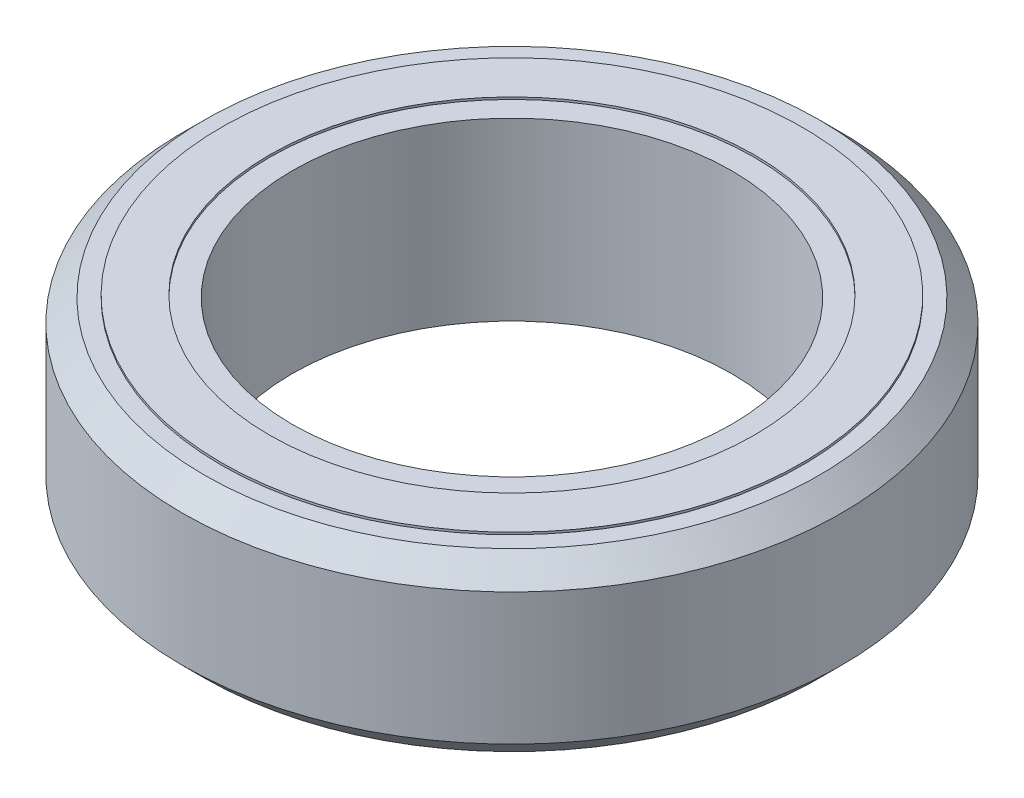
ISO-10303-21;
HEADER;
FILE_DESCRIPTION(('STEP AP214'),'2;1');
FILE_NAME('part.step','',(''),(''),'','','');
FILE_SCHEMA(('AUTOMOTIVE_DESIGN { 1 0 10303 214 1 1 1 1 }'));
ENDSEC;
DATA;
#1=APPLICATION_CONTEXT('core data for automotive mechanical design processes');
#2=APPLICATION_PROTOCOL_DEFINITION('international standard','automotive_design',2000,#1);
#3=PRODUCT_CONTEXT('',#1,'mechanical');
#4=PRODUCT('Part','Part','',(#3));
#5=PRODUCT_RELATED_PRODUCT_CATEGORY('part','',(#4));
#6=PRODUCT_DEFINITION_FORMATION('','',#4);
#7=PRODUCT_DEFINITION_CONTEXT('part definition',#1,'design');
#8=PRODUCT_DEFINITION('design','',#6,#7);
#9=PRODUCT_DEFINITION_SHAPE('','',#8);
#10=(LENGTH_UNIT() NAMED_UNIT(*) SI_UNIT(.MILLI.,.METRE.));
#11=(NAMED_UNIT(*) PLANE_ANGLE_UNIT() SI_UNIT($,.RADIAN.));
#12=(NAMED_UNIT(*) SI_UNIT($,.STERADIAN.) SOLID_ANGLE_UNIT());
#13=UNCERTAINTY_MEASURE_WITH_UNIT(LENGTH_MEASURE(1.E-05),#10,'distance_accuracy_value','');
#14=(GEOMETRIC_REPRESENTATION_CONTEXT(3) GLOBAL_UNCERTAINTY_ASSIGNED_CONTEXT((#13)) GLOBAL_UNIT_ASSIGNED_CONTEXT((#10,
#11,#12)) REPRESENTATION_CONTEXT('',''));
#15=CARTESIAN_POINT('',(0.,0.,0.));
#16=DIRECTION('',(0.,0.,1.));
#17=DIRECTION('',(1.,0.,0.));
#18=AXIS2_PLACEMENT_3D('',#15,#16,#17);
#19=CARTESIAN_POINT('',(0.,2.,0.));
#20=DIRECTION('',(0.,1.,0.));
#21=DIRECTION('',(0.,0.,1.));
#22=AXIS2_PLACEMENT_3D('',#19,#20,#21);
#23=PLANE('',#22);
#24=CARTESIAN_POINT('',(0.,2.,0.));
#25=DIRECTION('',(0.,1.,0.));
#26=DIRECTION('',(0.,0.,1.));
#27=AXIS2_PLACEMENT_3D('',#24,#25,#26);
#28=CIRCLE('',#27,6.61127186930803);
#29=CARTESIAN_POINT('',(0.,2.,6.61127186930803));
#30=VERTEX_POINT('',#29);
#31=EDGE_CURVE('E49',#30,#30,#28,.F.);
#32=ORIENTED_EDGE('',*,*,#31,.T.);
#33=EDGE_LOOP('',(#32));
#34=FACE_BOUND('',#33,.T.);
#35=CARTESIAN_POINT('',(0.,2.,0.));
#36=DIRECTION('',(0.,1.,0.));
#37=DIRECTION('',(0.,0.,1.));
#38=AXIS2_PLACEMENT_3D('',#35,#36,#37);
#39=CIRCLE('',#38,7.);
#40=CARTESIAN_POINT('',(0.,2.,7.));
#41=VERTEX_POINT('',#40);
#42=EDGE_CURVE('E44',#41,#41,#39,.T.);
#43=ORIENTED_EDGE('',*,*,#42,.T.);
#44=EDGE_LOOP('',(#43));
#45=FACE_BOUND('',#44,.T.);
#46=ADVANCED_FACE('F32',(#34,#45),#23,.T.);
#47=CARTESIAN_POINT('',(0.,-2.,0.));
#48=DIRECTION('',(0.,1.,0.));
#49=DIRECTION('',(0.,0.,1.));
#50=AXIS2_PLACEMENT_3D('',#47,#48,#49);
#51=PLANE('',#50);
#52=CARTESIAN_POINT('',(0.,-2.,0.));
#53=DIRECTION('',(0.,1.,0.));
#54=DIRECTION('',(0.,0.,1.));
#55=AXIS2_PLACEMENT_3D('',#52,#53,#54);
#56=CIRCLE('',#55,6.61127186930803);
#57=CARTESIAN_POINT('',(0.,-2.,6.61127186930803));
#58=VERTEX_POINT('',#57);
#59=EDGE_CURVE('E36',#58,#58,#56,.F.);
#60=ORIENTED_EDGE('',*,*,#59,.F.);
#61=EDGE_LOOP('',(#60));
#62=FACE_BOUND('',#61,.T.);
#63=CARTESIAN_POINT('',(0.,-2.,0.));
#64=DIRECTION('',(0.,1.,0.));
#65=DIRECTION('',(0.,0.,1.));
#66=AXIS2_PLACEMENT_3D('',#63,#64,#65);
#67=CIRCLE('',#66,7.);
#68=CARTESIAN_POINT('',(0.,-2.,7.));
#69=VERTEX_POINT('',#68);
#70=EDGE_CURVE('E65',#69,#69,#67,.F.);
#71=ORIENTED_EDGE('',*,*,#70,.T.);
#72=EDGE_LOOP('',(#71));
#73=FACE_BOUND('',#72,.T.);
#74=ADVANCED_FACE('F104',(#62,#73),#51,.F.);
#75=CARTESIAN_POINT('',(0.,2.,0.));
#76=DIRECTION('',(0.,-1.,0.));
#77=DIRECTION('',(0.,0.,-1.));
#78=AXIS2_PLACEMENT_3D('',#75,#76,#77);
#79=CYLINDRICAL_SURFACE('',#78,7.5);
#80=CARTESIAN_POINT('',(0.,-1.5,0.));
#81=DIRECTION('',(0.,1.,0.));
#82=DIRECTION('',(0.,0.,1.));
#83=AXIS2_PLACEMENT_3D('',#80,#81,#82);
#84=CIRCLE('',#83,7.5);
#85=CARTESIAN_POINT('',(0.,-1.5,7.5));
#86=VERTEX_POINT('',#85);
#87=EDGE_CURVE('E62',#86,#86,#84,.T.);
#88=ORIENTED_EDGE('',*,*,#87,.T.);
#89=EDGE_LOOP('',(#88));
#90=FACE_BOUND('',#89,.T.);
#91=CARTESIAN_POINT('',(0.,1.5,0.));
#92=DIRECTION('',(0.,1.,0.));
#93=DIRECTION('',(0.,0.,1.));
#94=AXIS2_PLACEMENT_3D('',#91,#92,#93);
#95=CIRCLE('',#94,7.5);
#96=CARTESIAN_POINT('',(0.,1.5,7.5));
#97=VERTEX_POINT('',#96);
#98=EDGE_CURVE('E57',#97,#97,#95,.F.);
#99=ORIENTED_EDGE('',*,*,#98,.T.);
#100=EDGE_LOOP('',(#99));
#101=FACE_BOUND('',#100,.T.);
#102=ADVANCED_FACE('F111',(#90,#101),#79,.T.);
#103=CARTESIAN_POINT('',(0.,-1.5,0.));
#104=DIRECTION('',(0.,1.,0.));
#105=DIRECTION('',(0.,0.,1.));
#106=AXIS2_PLACEMENT_3D('',#103,#104,#105);
#107=CONICAL_SURFACE('',#106,7.5,0.785398163397448);
#108=ORIENTED_EDGE('',*,*,#70,.F.);
#109=EDGE_LOOP('',(#108));
#110=FACE_BOUND('',#109,.T.);
#111=ORIENTED_EDGE('',*,*,#87,.F.);
#112=EDGE_LOOP('',(#111));
#113=FACE_BOUND('',#112,.T.);
#114=ADVANCED_FACE('F135',(#110,#113),#107,.T.);
#115=CARTESIAN_POINT('',(0.,2.,0.));
#116=DIRECTION('',(0.,-1.,0.));
#117=DIRECTION('',(0.,0.,-1.));
#118=AXIS2_PLACEMENT_3D('',#115,#116,#117);
#119=CONICAL_SURFACE('',#118,7.,0.785398163397447);
#120=ORIENTED_EDGE('',*,*,#98,.F.);
#121=EDGE_LOOP('',(#120));
#122=FACE_BOUND('',#121,.T.);
#123=ORIENTED_EDGE('',*,*,#42,.F.);
#124=EDGE_LOOP('',(#123));
#125=FACE_BOUND('',#124,.T.);
#126=ADVANCED_FACE('F34',(#122,#125),#119,.T.);
#127=CARTESIAN_POINT('',(0.,2.05,0.));
#128=DIRECTION('',(0.,-1.,0.));
#129=DIRECTION('',(0.,0.,-1.));
#130=AXIS2_PLACEMENT_3D('',#127,#128,#129);
#131=CYLINDRICAL_SURFACE('',#130,6.61127186930803);
#132=CARTESIAN_POINT('',(0.,-2.05,0.));
#133=DIRECTION('',(0.,1.,0.));
#134=DIRECTION('',(0.,0.,1.));
#135=AXIS2_PLACEMENT_3D('',#132,#133,#134);
#136=CIRCLE('',#135,6.61127186930803);
#137=CARTESIAN_POINT('',(0.,-2.05,6.61127186930803));
#138=VERTEX_POINT('',#137);
#139=EDGE_CURVE('E47',#138,#138,#136,.T.);
#140=ORIENTED_EDGE('',*,*,#139,.T.);
#141=EDGE_LOOP('',(#140));
#142=FACE_BOUND('',#141,.T.);
#143=ORIENTED_EDGE('',*,*,#59,.T.);
#144=EDGE_LOOP('',(#143));
#145=FACE_BOUND('',#144,.T.);
#146=ADVANCED_FACE('F98',(#142,#145),#131,.T.);
#147=CARTESIAN_POINT('',(0.,-2.05,0.));
#148=DIRECTION('',(0.,1.,0.));
#149=DIRECTION('',(0.,0.,1.));
#150=AXIS2_PLACEMENT_3D('',#147,#148,#149);
#151=PLANE('',#150);
#152=ORIENTED_EDGE('',*,*,#139,.F.);
#153=EDGE_LOOP('',(#152));
#154=FACE_BOUND('',#153,.T.);
#155=CARTESIAN_POINT('',(0.,-2.05,0.));
#156=DIRECTION('',(0.,1.,0.));
#157=DIRECTION('',(0.,0.,1.));
#158=AXIS2_PLACEMENT_3D('',#155,#156,#157);
#159=CIRCLE('',#158,5.52085763875581);
#160=CARTESIAN_POINT('',(0.,-2.05,5.52085763875581));
#161=VERTEX_POINT('',#160);
#162=EDGE_CURVE('E79',#161,#161,#159,.T.);
#163=ORIENTED_EDGE('',*,*,#162,.T.);
#164=EDGE_LOOP('',(#163));
#165=FACE_BOUND('',#164,.T.);
#166=ADVANCED_FACE('F99',(#154,#165),#151,.F.);
#167=CARTESIAN_POINT('',(0.,2.05,0.));
#168=DIRECTION('',(0.,-1.,0.));
#169=DIRECTION('',(0.,0.,-1.));
#170=AXIS2_PLACEMENT_3D('',#167,#168,#169);
#171=CYLINDRICAL_SURFACE('',#170,5.52085763875581);
#172=ORIENTED_EDGE('',*,*,#162,.F.);
#173=EDGE_LOOP('',(#172));
#174=FACE_BOUND('',#173,.T.);
#175=CARTESIAN_POINT('',(0.,-2.,0.));
#176=DIRECTION('',(0.,1.,0.));
#177=DIRECTION('',(0.,0.,1.));
#178=AXIS2_PLACEMENT_3D('',#175,#176,#177);
#179=CIRCLE('',#178,5.52085763875581);
#180=CARTESIAN_POINT('',(0.,-2.,5.52085763875581));
#181=VERTEX_POINT('',#180);
#182=EDGE_CURVE('E53',#181,#181,#179,.F.);
#183=ORIENTED_EDGE('',*,*,#182,.F.);
#184=EDGE_LOOP('',(#183));
#185=FACE_BOUND('',#184,.T.);
#186=ADVANCED_FACE('F90',(#174,#185),#171,.F.);
#187=CARTESIAN_POINT('',(0.,2.05,0.));
#188=DIRECTION('',(0.,1.,0.));
#189=DIRECTION('',(0.,0.,1.));
#190=AXIS2_PLACEMENT_3D('',#187,#188,#189);
#191=PLANE('',#190);
#192=CARTESIAN_POINT('',(0.,2.05,0.));
#193=DIRECTION('',(0.,1.,0.));
#194=DIRECTION('',(0.,0.,1.));
#195=AXIS2_PLACEMENT_3D('',#192,#193,#194);
#196=CIRCLE('',#195,6.61127186930803);
#197=CARTESIAN_POINT('',(0.,2.05,6.61127186930803));
#198=VERTEX_POINT('',#197);
#199=EDGE_CURVE('E70',#198,#198,#196,.T.);
#200=ORIENTED_EDGE('',*,*,#199,.T.);
#201=EDGE_LOOP('',(#200));
#202=FACE_BOUND('',#201,.T.);
#203=CARTESIAN_POINT('',(0.,2.05,0.));
#204=DIRECTION('',(0.,1.,0.));
#205=DIRECTION('',(0.,0.,1.));
#206=AXIS2_PLACEMENT_3D('',#203,#204,#205);
#207=CIRCLE('',#206,5.52085763875581);
#208=CARTESIAN_POINT('',(0.,2.05,5.52085763875581));
#209=VERTEX_POINT('',#208);
#210=EDGE_CURVE('E77',#209,#209,#207,.T.);
#211=ORIENTED_EDGE('',*,*,#210,.F.);
#212=EDGE_LOOP('',(#211));
#213=FACE_BOUND('',#212,.T.);
#214=ADVANCED_FACE('F87',(#202,#213),#191,.T.);
#215=ORIENTED_EDGE('',*,*,#31,.F.);
#216=EDGE_LOOP('',(#215));
#217=FACE_BOUND('',#216,.T.);
#218=ORIENTED_EDGE('',*,*,#199,.F.);
#219=EDGE_LOOP('',(#218));
#220=FACE_BOUND('',#219,.T.);
#221=ADVANCED_FACE('F89',(#217,#220),#131,.T.);
#222=CARTESIAN_POINT('',(0.,2.,0.));
#223=DIRECTION('',(0.,1.,0.));
#224=DIRECTION('',(0.,0.,1.));
#225=AXIS2_PLACEMENT_3D('',#222,#223,#224);
#226=CIRCLE('',#225,5.52085763875581);
#227=CARTESIAN_POINT('',(0.,2.,5.52085763875581));
#228=VERTEX_POINT('',#227);
#229=EDGE_CURVE('E10',#228,#228,#226,.F.);
#230=ORIENTED_EDGE('',*,*,#229,.T.);
#231=EDGE_LOOP('',(#230));
#232=FACE_BOUND('',#231,.T.);
#233=ORIENTED_EDGE('',*,*,#210,.T.);
#234=EDGE_LOOP('',(#233));
#235=FACE_BOUND('',#234,.T.);
#236=ADVANCED_FACE('F85',(#232,#235),#171,.F.);
#237=CARTESIAN_POINT('',(0.,2.,0.));
#238=DIRECTION('',(0.,1.,0.));
#239=DIRECTION('',(0.,0.,1.));
#240=AXIS2_PLACEMENT_3D('',#237,#238,#239);
#241=CIRCLE('',#240,5.);
#242=CARTESIAN_POINT('',(0.,2.,5.));
#243=VERTEX_POINT('',#242);
#244=EDGE_CURVE('E54',#243,#243,#241,.T.);
#245=ORIENTED_EDGE('',*,*,#244,.F.);
#246=EDGE_LOOP('',(#245));
#247=FACE_BOUND('',#246,.T.);
#248=ORIENTED_EDGE('',*,*,#229,.F.);
#249=EDGE_LOOP('',(#248));
#250=FACE_BOUND('',#249,.T.);
#251=ADVANCED_FACE('F107',(#247,#250),#23,.T.);
#252=CARTESIAN_POINT('',(0.,2.,0.));
#253=DIRECTION('',(0.,-1.,0.));
#254=DIRECTION('',(0.,0.,-1.));
#255=AXIS2_PLACEMENT_3D('',#252,#253,#254);
#256=CYLINDRICAL_SURFACE('',#255,5.);
#257=ORIENTED_EDGE('',*,*,#244,.T.);
#258=EDGE_LOOP('',(#257));
#259=FACE_BOUND('',#258,.T.);
#260=CARTESIAN_POINT('',(0.,-2.,0.));
#261=DIRECTION('',(0.,1.,0.));
#262=DIRECTION('',(0.,0.,1.));
#263=AXIS2_PLACEMENT_3D('',#260,#261,#262);
#264=CIRCLE('',#263,5.);
#265=CARTESIAN_POINT('',(0.,-2.,5.));
#266=VERTEX_POINT('',#265);
#267=EDGE_CURVE('E52',#266,#266,#264,.T.);
#268=ORIENTED_EDGE('',*,*,#267,.F.);
#269=EDGE_LOOP('',(#268));
#270=FACE_BOUND('',#269,.T.);
#271=ADVANCED_FACE('F118',(#259,#270),#256,.F.);
#272=ORIENTED_EDGE('',*,*,#267,.T.);
#273=EDGE_LOOP('',(#272));
#274=FACE_BOUND('',#273,.T.);
#275=ORIENTED_EDGE('',*,*,#182,.T.);
#276=EDGE_LOOP('',(#275));
#277=FACE_BOUND('',#276,.T.);
#278=ADVANCED_FACE('F114',(#274,#277),#51,.F.);
#279=CLOSED_SHELL('',(#46,#74,#102,#114,#126,#146,#166,#186,#214,#221,#236,#251,#271,#278));
#280=MANIFOLD_SOLID_BREP('B2',#279);
#281=ADVANCED_BREP_SHAPE_REPRESENTATION('',(#18,#280),#14);
#282=SHAPE_DEFINITION_REPRESENTATION(#9,#281);
ENDSEC;
END-ISO-10303-21;
